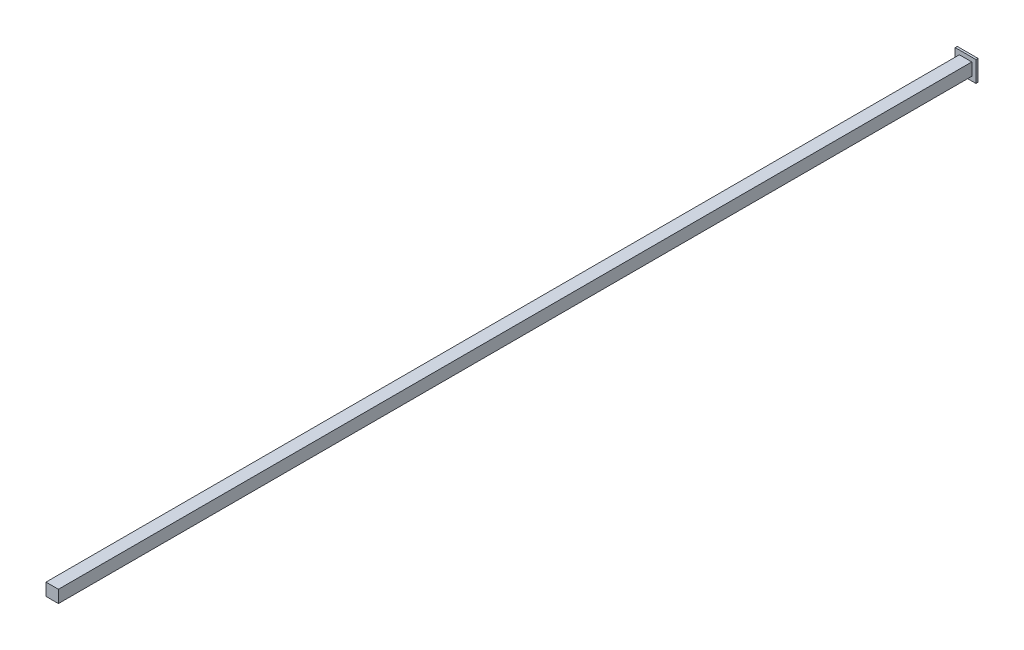
ISO-10303-21;
HEADER;
FILE_DESCRIPTION(('STEP AP214'),'2;1');
FILE_NAME('part.step','',(''),(''),'','','');
FILE_SCHEMA(('AUTOMOTIVE_DESIGN { 1 0 10303 214 1 1 1 1 }'));
ENDSEC;
DATA;
#1=APPLICATION_CONTEXT('core data for automotive mechanical design processes');
#2=APPLICATION_PROTOCOL_DEFINITION('international standard','automotive_design',2000,#1);
#3=PRODUCT_CONTEXT('',#1,'mechanical');
#4=PRODUCT('Part','Part','',(#3));
#5=PRODUCT_RELATED_PRODUCT_CATEGORY('part','',(#4));
#6=PRODUCT_DEFINITION_FORMATION('','',#4);
#7=PRODUCT_DEFINITION_CONTEXT('part definition',#1,'design');
#8=PRODUCT_DEFINITION('design','',#6,#7);
#9=PRODUCT_DEFINITION_SHAPE('','',#8);
#10=(LENGTH_UNIT() NAMED_UNIT(*) SI_UNIT(.MILLI.,.METRE.));
#11=(NAMED_UNIT(*) PLANE_ANGLE_UNIT() SI_UNIT($,.RADIAN.));
#12=(NAMED_UNIT(*) SI_UNIT($,.STERADIAN.) SOLID_ANGLE_UNIT());
#13=UNCERTAINTY_MEASURE_WITH_UNIT(LENGTH_MEASURE(1.E-05),#10,'distance_accuracy_value','');
#14=(GEOMETRIC_REPRESENTATION_CONTEXT(3) GLOBAL_UNCERTAINTY_ASSIGNED_CONTEXT((#13)) GLOBAL_UNIT_ASSIGNED_CONTEXT((#10,
#11,#12)) REPRESENTATION_CONTEXT('',''));
#15=CARTESIAN_POINT('',(0.,0.,0.));
#16=DIRECTION('',(0.,0.,1.));
#17=DIRECTION('',(1.,0.,0.));
#18=AXIS2_PLACEMENT_3D('',#15,#16,#17);
#19=CARTESIAN_POINT('',(0.,0.,5.));
#20=DIRECTION('',(0.,0.,-1.));
#21=DIRECTION('',(-1.,0.,0.));
#22=AXIS2_PLACEMENT_3D('',#19,#20,#21);
#23=PLANE('',#22);
#24=DIRECTION('',(0.,1.,0.));
#25=VECTOR('',#24,1.);
#26=CARTESIAN_POINT('',(25.,-25.,5.));
#27=LINE('',#26,#25);
#28=CARTESIAN_POINT('',(25.,-25.,5.));
#29=VERTEX_POINT('',#28);
#30=CARTESIAN_POINT('',(25.,25.,5.));
#31=VERTEX_POINT('',#30);
#32=EDGE_CURVE('E207',#29,#31,#27,.T.);
#33=ORIENTED_EDGE('',*,*,#32,.T.);
#34=DIRECTION('',(-1.,0.,0.));
#35=VECTOR('',#34,1.);
#36=CARTESIAN_POINT('',(-25.,25.,5.));
#37=LINE('',#36,#35);
#38=CARTESIAN_POINT('',(-25.,25.,5.));
#39=VERTEX_POINT('',#38);
#40=EDGE_CURVE('E211',#31,#39,#37,.T.);
#41=ORIENTED_EDGE('',*,*,#40,.T.);
#42=DIRECTION('',(0.,-1.,0.));
#43=VECTOR('',#42,1.);
#44=CARTESIAN_POINT('',(-25.,-25.,5.));
#45=LINE('',#44,#43);
#46=CARTESIAN_POINT('',(-25.,-25.,5.));
#47=VERTEX_POINT('',#46);
#48=EDGE_CURVE('E215',#39,#47,#45,.T.);
#49=ORIENTED_EDGE('',*,*,#48,.T.);
#50=DIRECTION('',(1.,0.,0.));
#51=VECTOR('',#50,1.);
#52=CARTESIAN_POINT('',(-25.,-25.,5.));
#53=LINE('',#52,#51);
#54=EDGE_CURVE('E218',#47,#29,#53,.T.);
#55=ORIENTED_EDGE('',*,*,#54,.T.);
#56=EDGE_LOOP('',(#33,#41,#49,#55));
#57=FACE_BOUND('',#56,.T.);
#58=DIRECTION('',(0.,1.,0.));
#59=VECTOR('',#58,1.);
#60=CARTESIAN_POINT('',(15.,-15.,5.));
#61=LINE('',#60,#59);
#62=CARTESIAN_POINT('',(15.,-15.,5.));
#63=VERTEX_POINT('',#62);
#64=CARTESIAN_POINT('',(15.,15.,5.));
#65=VERTEX_POINT('',#64);
#66=EDGE_CURVE('E156',#63,#65,#61,.T.);
#67=ORIENTED_EDGE('',*,*,#66,.F.);
#68=DIRECTION('',(1.,0.,0.));
#69=VECTOR('',#68,1.);
#70=CARTESIAN_POINT('',(-15.,-15.,5.));
#71=LINE('',#70,#69);
#72=CARTESIAN_POINT('',(-15.,-15.,5.));
#73=VERTEX_POINT('',#72);
#74=EDGE_CURVE('E175',#73,#63,#71,.T.);
#75=ORIENTED_EDGE('',*,*,#74,.F.);
#76=DIRECTION('',(0.,-1.,0.));
#77=VECTOR('',#76,1.);
#78=CARTESIAN_POINT('',(-15.,-15.,5.));
#79=LINE('',#78,#77);
#80=CARTESIAN_POINT('',(-15.,15.,5.));
#81=VERTEX_POINT('',#80);
#82=EDGE_CURVE('E186',#81,#73,#79,.T.);
#83=ORIENTED_EDGE('',*,*,#82,.F.);
#84=DIRECTION('',(-1.,0.,0.));
#85=VECTOR('',#84,1.);
#86=CARTESIAN_POINT('',(-15.,15.,5.));
#87=LINE('',#86,#85);
#88=EDGE_CURVE('E69',#65,#81,#87,.T.);
#89=ORIENTED_EDGE('',*,*,#88,.F.);
#90=EDGE_LOOP('',(#67,#75,#83,#89));
#91=FACE_BOUND('',#90,.T.);
#92=ADVANCED_FACE('F44',(#57,#91),#23,.F.);
#93=CARTESIAN_POINT('',(25.,-25.,5.));
#94=DIRECTION('',(-1.,0.,0.));
#95=DIRECTION('',(0.,0.,1.));
#96=AXIS2_PLACEMENT_3D('',#93,#94,#95);
#97=PLANE('',#96);
#98=DIRECTION('',(0.,1.,0.));
#99=VECTOR('',#98,1.);
#100=CARTESIAN_POINT('',(25.,-25.,0.));
#101=LINE('',#100,#99);
#102=CARTESIAN_POINT('',(25.,-25.,0.));
#103=VERTEX_POINT('',#102);
#104=CARTESIAN_POINT('',(25.,25.,0.));
#105=VERTEX_POINT('',#104);
#106=EDGE_CURVE('E206',#103,#105,#101,.T.);
#107=ORIENTED_EDGE('',*,*,#106,.T.);
#108=DIRECTION('',(0.,0.,-1.));
#109=VECTOR('',#108,1.);
#110=CARTESIAN_POINT('',(25.,25.,5.));
#111=LINE('',#110,#109);
#112=EDGE_CURVE('E11',#31,#105,#111,.T.);
#113=ORIENTED_EDGE('',*,*,#112,.F.);
#114=ORIENTED_EDGE('',*,*,#32,.F.);
#115=DIRECTION('',(0.,0.,-1.));
#116=VECTOR('',#115,1.);
#117=CARTESIAN_POINT('',(25.,-25.,5.));
#118=LINE('',#117,#116);
#119=EDGE_CURVE('E221',#29,#103,#118,.T.);
#120=ORIENTED_EDGE('',*,*,#119,.T.);
#121=EDGE_LOOP('',(#107,#113,#114,#120));
#122=FACE_BOUND('',#121,.T.);
#123=ADVANCED_FACE('F46',(#122),#97,.F.);
#124=CARTESIAN_POINT('',(-25.,25.,5.));
#125=DIRECTION('',(0.,-1.,0.));
#126=DIRECTION('',(0.,0.,-1.));
#127=AXIS2_PLACEMENT_3D('',#124,#125,#126);
#128=PLANE('',#127);
#129=DIRECTION('',(-1.,0.,0.));
#130=VECTOR('',#129,1.);
#131=CARTESIAN_POINT('',(-25.,25.,0.));
#132=LINE('',#131,#130);
#133=CARTESIAN_POINT('',(-25.,25.,0.));
#134=VERTEX_POINT('',#133);
#135=EDGE_CURVE('E225',#105,#134,#132,.T.);
#136=ORIENTED_EDGE('',*,*,#135,.T.);
#137=DIRECTION('',(0.,0.,-1.));
#138=VECTOR('',#137,1.);
#139=CARTESIAN_POINT('',(-25.,25.,5.));
#140=LINE('',#139,#138);
#141=EDGE_CURVE('E54',#39,#134,#140,.T.);
#142=ORIENTED_EDGE('',*,*,#141,.F.);
#143=ORIENTED_EDGE('',*,*,#40,.F.);
#144=ORIENTED_EDGE('',*,*,#112,.T.);
#145=EDGE_LOOP('',(#136,#142,#143,#144));
#146=FACE_BOUND('',#145,.T.);
#147=ADVANCED_FACE('F262',(#146),#128,.F.);
#148=CARTESIAN_POINT('',(-25.,-25.,5.));
#149=DIRECTION('',(1.,0.,0.));
#150=DIRECTION('',(0.,0.,-1.));
#151=AXIS2_PLACEMENT_3D('',#148,#149,#150);
#152=PLANE('',#151);
#153=DIRECTION('',(0.,-1.,0.));
#154=VECTOR('',#153,1.);
#155=CARTESIAN_POINT('',(-25.,-25.,0.));
#156=LINE('',#155,#154);
#157=CARTESIAN_POINT('',(-25.,-25.,0.));
#158=VERTEX_POINT('',#157);
#159=EDGE_CURVE('E228',#134,#158,#156,.T.);
#160=ORIENTED_EDGE('',*,*,#159,.T.);
#161=DIRECTION('',(0.,0.,-1.));
#162=VECTOR('',#161,1.);
#163=CARTESIAN_POINT('',(-25.,-25.,5.));
#164=LINE('',#163,#162);
#165=EDGE_CURVE('E236',#47,#158,#164,.T.);
#166=ORIENTED_EDGE('',*,*,#165,.F.);
#167=ORIENTED_EDGE('',*,*,#48,.F.);
#168=ORIENTED_EDGE('',*,*,#141,.T.);
#169=EDGE_LOOP('',(#160,#166,#167,#168));
#170=FACE_BOUND('',#169,.T.);
#171=ADVANCED_FACE('F247',(#170),#152,.F.);
#172=CARTESIAN_POINT('',(-25.,-25.,5.));
#173=DIRECTION('',(0.,1.,0.));
#174=DIRECTION('',(0.,0.,1.));
#175=AXIS2_PLACEMENT_3D('',#172,#173,#174);
#176=PLANE('',#175);
#177=DIRECTION('',(1.,0.,0.));
#178=VECTOR('',#177,1.);
#179=CARTESIAN_POINT('',(-25.,-25.,0.));
#180=LINE('',#179,#178);
#181=EDGE_CURVE('E212',#158,#103,#180,.T.);
#182=ORIENTED_EDGE('',*,*,#181,.T.);
#183=ORIENTED_EDGE('',*,*,#119,.F.);
#184=ORIENTED_EDGE('',*,*,#54,.F.);
#185=ORIENTED_EDGE('',*,*,#165,.T.);
#186=EDGE_LOOP('',(#182,#183,#184,#185));
#187=FACE_BOUND('',#186,.T.);
#188=ADVANCED_FACE('F256',(#187),#176,.F.);
#189=CARTESIAN_POINT('',(0.,0.,0.));
#190=DIRECTION('',(0.,0.,-1.));
#191=DIRECTION('',(-1.,0.,0.));
#192=AXIS2_PLACEMENT_3D('',#189,#190,#191);
#193=PLANE('',#192);
#194=ORIENTED_EDGE('',*,*,#106,.F.);
#195=ORIENTED_EDGE('',*,*,#181,.F.);
#196=ORIENTED_EDGE('',*,*,#159,.F.);
#197=ORIENTED_EDGE('',*,*,#135,.F.);
#198=EDGE_LOOP('',(#194,#195,#196,#197));
#199=FACE_BOUND('',#198,.T.);
#200=ADVANCED_FACE('F253',(#199),#193,.T.);
#201=CARTESIAN_POINT('',(0.,0.,2210.));
#202=DIRECTION('',(0.,0.,-1.));
#203=DIRECTION('',(-1.,0.,0.));
#204=AXIS2_PLACEMENT_3D('',#201,#202,#203);
#205=PLANE('',#204);
#206=DIRECTION('',(0.,1.,0.));
#207=VECTOR('',#206,1.);
#208=CARTESIAN_POINT('',(15.,-15.,2210.));
#209=LINE('',#208,#207);
#210=CARTESIAN_POINT('',(15.,-15.,2210.));
#211=VERTEX_POINT('',#210);
#212=CARTESIAN_POINT('',(15.,15.,2210.));
#213=VERTEX_POINT('',#212);
#214=EDGE_CURVE('E170',#211,#213,#209,.T.);
#215=ORIENTED_EDGE('',*,*,#214,.T.);
#216=DIRECTION('',(-1.,0.,0.));
#217=VECTOR('',#216,1.);
#218=CARTESIAN_POINT('',(-15.,15.,2210.));
#219=LINE('',#218,#217);
#220=CARTESIAN_POINT('',(-15.,15.,2210.));
#221=VERTEX_POINT('',#220);
#222=EDGE_CURVE('E174',#213,#221,#219,.T.);
#223=ORIENTED_EDGE('',*,*,#222,.T.);
#224=DIRECTION('',(0.,-1.,0.));
#225=VECTOR('',#224,1.);
#226=CARTESIAN_POINT('',(-15.,-15.,2210.));
#227=LINE('',#226,#225);
#228=CARTESIAN_POINT('',(-15.,-15.,2210.));
#229=VERTEX_POINT('',#228);
#230=EDGE_CURVE('E177',#221,#229,#227,.T.);
#231=ORIENTED_EDGE('',*,*,#230,.T.);
#232=DIRECTION('',(1.,0.,0.));
#233=VECTOR('',#232,1.);
#234=CARTESIAN_POINT('',(-15.,-15.,2210.));
#235=LINE('',#234,#233);
#236=EDGE_CURVE('E180',#229,#211,#235,.T.);
#237=ORIENTED_EDGE('',*,*,#236,.T.);
#238=EDGE_LOOP('',(#215,#223,#231,#237));
#239=FACE_BOUND('',#238,.T.);
#240=ADVANCED_FACE('F355',(#239),#205,.F.);
#241=CARTESIAN_POINT('',(15.,-15.,2210.));
#242=DIRECTION('',(-1.,0.,0.));
#243=DIRECTION('',(0.,0.,1.));
#244=AXIS2_PLACEMENT_3D('',#241,#242,#243);
#245=PLANE('',#244);
#246=ORIENTED_EDGE('',*,*,#66,.T.);
#247=DIRECTION('',(0.,0.,-1.));
#248=VECTOR('',#247,1.);
#249=CARTESIAN_POINT('',(15.,15.,2210.));
#250=LINE('',#249,#248);
#251=EDGE_CURVE('E203',#213,#65,#250,.T.);
#252=ORIENTED_EDGE('',*,*,#251,.F.);
#253=ORIENTED_EDGE('',*,*,#214,.F.);
#254=DIRECTION('',(0.,0.,-1.));
#255=VECTOR('',#254,1.);
#256=CARTESIAN_POINT('',(15.,-15.,2210.));
#257=LINE('',#256,#255);
#258=EDGE_CURVE('E182',#211,#63,#257,.T.);
#259=ORIENTED_EDGE('',*,*,#258,.T.);
#260=EDGE_LOOP('',(#246,#252,#253,#259));
#261=FACE_BOUND('',#260,.T.);
#262=ADVANCED_FACE('F358',(#261),#245,.F.);
#263=CARTESIAN_POINT('',(-15.,15.,2210.));
#264=DIRECTION('',(0.,-1.,0.));
#265=DIRECTION('',(0.,0.,-1.));
#266=AXIS2_PLACEMENT_3D('',#263,#264,#265);
#267=PLANE('',#266);
#268=ORIENTED_EDGE('',*,*,#88,.T.);
#269=DIRECTION('',(0.,0.,-1.));
#270=VECTOR('',#269,1.);
#271=CARTESIAN_POINT('',(-15.,15.,2210.));
#272=LINE('',#271,#270);
#273=EDGE_CURVE('E200',#221,#81,#272,.T.);
#274=ORIENTED_EDGE('',*,*,#273,.F.);
#275=ORIENTED_EDGE('',*,*,#222,.F.);
#276=ORIENTED_EDGE('',*,*,#251,.T.);
#277=EDGE_LOOP('',(#268,#274,#275,#276));
#278=FACE_BOUND('',#277,.T.);
#279=ADVANCED_FACE('F366',(#278),#267,.F.);
#280=CARTESIAN_POINT('',(-15.,-15.,2210.));
#281=DIRECTION('',(1.,0.,0.));
#282=DIRECTION('',(0.,0.,-1.));
#283=AXIS2_PLACEMENT_3D('',#280,#281,#282);
#284=PLANE('',#283);
#285=ORIENTED_EDGE('',*,*,#82,.T.);
#286=DIRECTION('',(0.,0.,-1.));
#287=VECTOR('',#286,1.);
#288=CARTESIAN_POINT('',(-15.,-15.,2210.));
#289=LINE('',#288,#287);
#290=EDGE_CURVE('E196',#229,#73,#289,.T.);
#291=ORIENTED_EDGE('',*,*,#290,.F.);
#292=ORIENTED_EDGE('',*,*,#230,.F.);
#293=ORIENTED_EDGE('',*,*,#273,.T.);
#294=EDGE_LOOP('',(#285,#291,#292,#293));
#295=FACE_BOUND('',#294,.T.);
#296=ADVANCED_FACE('F362',(#295),#284,.F.);
#297=CARTESIAN_POINT('',(-15.,-15.,2210.));
#298=DIRECTION('',(0.,1.,0.));
#299=DIRECTION('',(0.,0.,1.));
#300=AXIS2_PLACEMENT_3D('',#297,#298,#299);
#301=PLANE('',#300);
#302=ORIENTED_EDGE('',*,*,#74,.T.);
#303=ORIENTED_EDGE('',*,*,#258,.F.);
#304=ORIENTED_EDGE('',*,*,#236,.F.);
#305=ORIENTED_EDGE('',*,*,#290,.T.);
#306=EDGE_LOOP('',(#302,#303,#304,#305));
#307=FACE_BOUND('',#306,.T.);
#308=ADVANCED_FACE('F360',(#307),#301,.F.);
#309=CLOSED_SHELL('',(#92,#123,#147,#171,#188,#200,#240,#262,#279,#296,#308));
#310=DIRECTION('',(1.,0.,0.));
#311=VECTOR('',#310,1.);
#312=CARTESIAN_POINT('',(-12.,-12.,5.));
#313=LINE('',#312,#311);
#314=CARTESIAN_POINT('',(-12.,-12.,5.));
#315=VERTEX_POINT('',#314);
#316=CARTESIAN_POINT('',(12.,-12.,5.));
#317=VERTEX_POINT('',#316);
#318=EDGE_CURVE('E290',#315,#317,#313,.T.);
#319=ORIENTED_EDGE('',*,*,#318,.T.);
#320=DIRECTION('',(0.,1.,0.));
#321=VECTOR('',#320,1.);
#322=CARTESIAN_POINT('',(12.,12.,5.));
#323=LINE('',#322,#321);
#324=CARTESIAN_POINT('',(12.,12.,5.));
#325=VERTEX_POINT('',#324);
#326=EDGE_CURVE('E291',#317,#325,#323,.T.);
#327=ORIENTED_EDGE('',*,*,#326,.T.);
#328=DIRECTION('',(-1.,0.,0.));
#329=VECTOR('',#328,1.);
#330=CARTESIAN_POINT('',(-12.,12.,5.));
#331=LINE('',#330,#329);
#332=CARTESIAN_POINT('',(-12.,12.,5.));
#333=VERTEX_POINT('',#332);
#334=EDGE_CURVE('E153',#325,#333,#331,.T.);
#335=ORIENTED_EDGE('',*,*,#334,.T.);
#336=DIRECTION('',(0.,-1.,0.));
#337=VECTOR('',#336,1.);
#338=CARTESIAN_POINT('',(-12.,12.,5.));
#339=LINE('',#338,#337);
#340=EDGE_CURVE('E293',#333,#315,#339,.T.);
#341=ORIENTED_EDGE('',*,*,#340,.T.);
#342=EDGE_LOOP('',(#319,#327,#335,#341));
#343=FACE_BOUND('',#342,.T.);
#344=ADVANCED_FACE('F271',(#343),#23,.F.);
#345=CARTESIAN_POINT('',(-12.,-12.,2210.));
#346=DIRECTION('',(0.,1.,0.));
#347=DIRECTION('',(0.,0.,1.));
#348=AXIS2_PLACEMENT_3D('',#345,#346,#347);
#349=PLANE('',#348);
#350=DIRECTION('',(0.,0.,-1.));
#351=VECTOR('',#350,1.);
#352=CARTESIAN_POINT('',(-12.,-12.,2210.));
#353=LINE('',#352,#351);
#354=CARTESIAN_POINT('',(-12.,-12.,2205.));
#355=VERTEX_POINT('',#354);
#356=EDGE_CURVE('E166',#355,#315,#353,.T.);
#357=ORIENTED_EDGE('',*,*,#356,.F.);
#358=DIRECTION('',(1.,0.,0.));
#359=VECTOR('',#358,1.);
#360=CARTESIAN_POINT('',(-12.,-12.,2205.));
#361=LINE('',#360,#359);
#362=CARTESIAN_POINT('',(12.,-12.,2205.));
#363=VERTEX_POINT('',#362);
#364=EDGE_CURVE('E305',#355,#363,#361,.T.);
#365=ORIENTED_EDGE('',*,*,#364,.T.);
#366=DIRECTION('',(0.,0.,-1.));
#367=VECTOR('',#366,1.);
#368=CARTESIAN_POINT('',(12.,-12.,2210.));
#369=LINE('',#368,#367);
#370=EDGE_CURVE('E148',#363,#317,#369,.T.);
#371=ORIENTED_EDGE('',*,*,#370,.T.);
#372=ORIENTED_EDGE('',*,*,#318,.F.);
#373=EDGE_LOOP('',(#357,#365,#371,#372));
#374=FACE_BOUND('',#373,.T.);
#375=ADVANCED_FACE('F277',(#374),#349,.T.);
#376=CARTESIAN_POINT('',(-12.,12.,2210.));
#377=DIRECTION('',(1.,0.,0.));
#378=DIRECTION('',(0.,1.,0.));
#379=AXIS2_PLACEMENT_3D('',#376,#377,#378);
#380=PLANE('',#379);
#381=DIRECTION('',(0.,0.,-1.));
#382=VECTOR('',#381,1.);
#383=CARTESIAN_POINT('',(-12.,12.,2210.));
#384=LINE('',#383,#382);
#385=CARTESIAN_POINT('',(-12.,12.,2205.));
#386=VERTEX_POINT('',#385);
#387=EDGE_CURVE('E157',#386,#333,#384,.T.);
#388=ORIENTED_EDGE('',*,*,#387,.F.);
#389=DIRECTION('',(0.,-1.,0.));
#390=VECTOR('',#389,1.);
#391=CARTESIAN_POINT('',(-12.,12.,2205.));
#392=LINE('',#391,#390);
#393=EDGE_CURVE('E136',#386,#355,#392,.T.);
#394=ORIENTED_EDGE('',*,*,#393,.T.);
#395=ORIENTED_EDGE('',*,*,#356,.T.);
#396=ORIENTED_EDGE('',*,*,#340,.F.);
#397=EDGE_LOOP('',(#388,#394,#395,#396));
#398=FACE_BOUND('',#397,.T.);
#399=ADVANCED_FACE('F284',(#398),#380,.T.);
#400=CARTESIAN_POINT('',(-12.,12.,2210.));
#401=DIRECTION('',(0.,-1.,0.));
#402=DIRECTION('',(0.,0.,-1.));
#403=AXIS2_PLACEMENT_3D('',#400,#401,#402);
#404=PLANE('',#403);
#405=DIRECTION('',(0.,0.,-1.));
#406=VECTOR('',#405,1.);
#407=CARTESIAN_POINT('',(12.,12.,2210.));
#408=LINE('',#407,#406);
#409=CARTESIAN_POINT('',(12.,12.,2205.));
#410=VERTEX_POINT('',#409);
#411=EDGE_CURVE('E146',#410,#325,#408,.T.);
#412=ORIENTED_EDGE('',*,*,#411,.F.);
#413=DIRECTION('',(-1.,0.,0.));
#414=VECTOR('',#413,1.);
#415=CARTESIAN_POINT('',(-12.,12.,2205.));
#416=LINE('',#415,#414);
#417=EDGE_CURVE('E133',#410,#386,#416,.T.);
#418=ORIENTED_EDGE('',*,*,#417,.T.);
#419=ORIENTED_EDGE('',*,*,#387,.T.);
#420=ORIENTED_EDGE('',*,*,#334,.F.);
#421=EDGE_LOOP('',(#412,#418,#419,#420));
#422=FACE_BOUND('',#421,.T.);
#423=ADVANCED_FACE('F151',(#422),#404,.T.);
#424=CARTESIAN_POINT('',(12.,12.,2210.));
#425=DIRECTION('',(-1.,0.,0.));
#426=DIRECTION('',(0.,-1.,0.));
#427=AXIS2_PLACEMENT_3D('',#424,#425,#426);
#428=PLANE('',#427);
#429=ORIENTED_EDGE('',*,*,#370,.F.);
#430=DIRECTION('',(0.,1.,0.));
#431=VECTOR('',#430,1.);
#432=CARTESIAN_POINT('',(12.,12.,2205.));
#433=LINE('',#432,#431);
#434=EDGE_CURVE('E61',#363,#410,#433,.T.);
#435=ORIENTED_EDGE('',*,*,#434,.T.);
#436=ORIENTED_EDGE('',*,*,#411,.T.);
#437=ORIENTED_EDGE('',*,*,#326,.F.);
#438=EDGE_LOOP('',(#429,#435,#436,#437));
#439=FACE_BOUND('',#438,.T.);
#440=ADVANCED_FACE('F144',(#439),#428,.T.);
#441=CARTESIAN_POINT('',(0.,0.,2205.));
#442=DIRECTION('',(0.,0.,1.));
#443=DIRECTION('',(1.,0.,0.));
#444=AXIS2_PLACEMENT_3D('',#441,#442,#443);
#445=PLANE('',#444);
#446=ORIENTED_EDGE('',*,*,#434,.F.);
#447=ORIENTED_EDGE('',*,*,#364,.F.);
#448=ORIENTED_EDGE('',*,*,#393,.F.);
#449=ORIENTED_EDGE('',*,*,#417,.F.);
#450=EDGE_LOOP('',(#446,#447,#448,#449));
#451=FACE_BOUND('',#450,.T.);
#452=ADVANCED_FACE('F134',(#451),#445,.F.);
#453=CLOSED_SHELL('',(#344,#375,#399,#423,#440,#452));
#454=ORIENTED_CLOSED_SHELL('',*,#453,.T.);
#455=BREP_WITH_VOIDS('B2',#309,(#454));
#456=ADVANCED_BREP_SHAPE_REPRESENTATION('',(#18,#455),#14);
#457=SHAPE_DEFINITION_REPRESENTATION(#9,#456);
ENDSEC;
END-ISO-10303-21;
